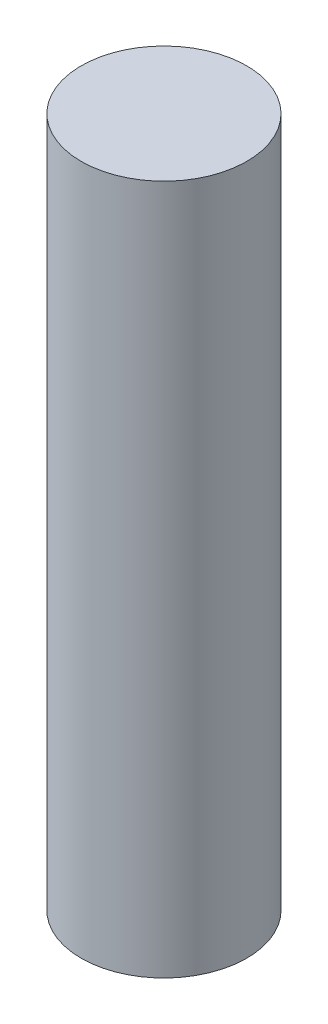
ISO-10303-21;
HEADER;
FILE_DESCRIPTION(('STEP AP214'),'2;1');
FILE_NAME('part.step','',(''),(''),'','','');
FILE_SCHEMA(('AUTOMOTIVE_DESIGN { 1 0 10303 214 1 1 1 1 }'));
ENDSEC;
DATA;
#1=APPLICATION_CONTEXT('core data for automotive mechanical design processes');
#2=APPLICATION_PROTOCOL_DEFINITION('international standard','automotive_design',2000,#1);
#3=PRODUCT_CONTEXT('',#1,'mechanical');
#4=PRODUCT('Part','Part','',(#3));
#5=PRODUCT_RELATED_PRODUCT_CATEGORY('part','',(#4));
#6=PRODUCT_DEFINITION_FORMATION('','',#4);
#7=PRODUCT_DEFINITION_CONTEXT('part definition',#1,'design');
#8=PRODUCT_DEFINITION('design','',#6,#7);
#9=PRODUCT_DEFINITION_SHAPE('','',#8);
#10=(LENGTH_UNIT() NAMED_UNIT(*) SI_UNIT(.MILLI.,.METRE.));
#11=(NAMED_UNIT(*) PLANE_ANGLE_UNIT() SI_UNIT($,.RADIAN.));
#12=(NAMED_UNIT(*) SI_UNIT($,.STERADIAN.) SOLID_ANGLE_UNIT());
#13=UNCERTAINTY_MEASURE_WITH_UNIT(LENGTH_MEASURE(1.E-05),#10,'distance_accuracy_value','');
#14=(GEOMETRIC_REPRESENTATION_CONTEXT(3) GLOBAL_UNCERTAINTY_ASSIGNED_CONTEXT((#13)) GLOBAL_UNIT_ASSIGNED_CONTEXT((#10,
#11,#12)) REPRESENTATION_CONTEXT('',''));
#15=CARTESIAN_POINT('',(0.,0.,0.));
#16=DIRECTION('',(0.,0.,1.));
#17=DIRECTION('',(1.,0.,0.));
#18=AXIS2_PLACEMENT_3D('',#15,#16,#17);
#19=CARTESIAN_POINT('',(0.,250.,0.));
#20=DIRECTION('',(0.,-1.,0.));
#21=DIRECTION('',(0.,0.,-1.));
#22=AXIS2_PLACEMENT_3D('',#19,#20,#21);
#23=CYLINDRICAL_SURFACE('',#22,30.);
#24=CARTESIAN_POINT('',(0.,250.,0.));
#25=DIRECTION('',(0.,1.,0.));
#26=DIRECTION('',(0.,0.,1.));
#27=AXIS2_PLACEMENT_3D('',#24,#25,#26);
#28=CIRCLE('',#27,30.);
#29=CARTESIAN_POINT('',(0.,250.,30.));
#30=VERTEX_POINT('',#29);
#31=EDGE_CURVE('E10',#30,#30,#28,.T.);
#32=ORIENTED_EDGE('',*,*,#31,.F.);
#33=EDGE_LOOP('',(#32));
#34=FACE_BOUND('',#33,.T.);
#35=CARTESIAN_POINT('',(0.,0.,0.));
#36=DIRECTION('',(0.,1.,0.));
#37=DIRECTION('',(0.,0.,1.));
#38=AXIS2_PLACEMENT_3D('',#35,#36,#37);
#39=CIRCLE('',#38,30.);
#40=CARTESIAN_POINT('',(0.,0.,30.));
#41=VERTEX_POINT('',#40);
#42=EDGE_CURVE('E40',#41,#41,#39,.T.);
#43=ORIENTED_EDGE('',*,*,#42,.T.);
#44=EDGE_LOOP('',(#43));
#45=FACE_BOUND('',#44,.T.);
#46=ADVANCED_FACE('F37',(#34,#45),#23,.T.);
#47=CARTESIAN_POINT('',(0.,250.,0.));
#48=DIRECTION('',(0.,1.,0.));
#49=DIRECTION('',(0.,0.,1.));
#50=AXIS2_PLACEMENT_3D('',#47,#48,#49);
#51=PLANE('',#50);
#52=ORIENTED_EDGE('',*,*,#31,.T.);
#53=EDGE_LOOP('',(#52));
#54=FACE_BOUND('',#53,.T.);
#55=ADVANCED_FACE('F54',(#54),#51,.T.);
#56=CARTESIAN_POINT('',(0.,0.,0.));
#57=DIRECTION('',(0.,1.,0.));
#58=DIRECTION('',(0.,0.,1.));
#59=AXIS2_PLACEMENT_3D('',#56,#57,#58);
#60=PLANE('',#59);
#61=ORIENTED_EDGE('',*,*,#42,.F.);
#62=EDGE_LOOP('',(#61));
#63=FACE_BOUND('',#62,.T.);
#64=ADVANCED_FACE('F52',(#63),#60,.F.);
#65=CLOSED_SHELL('',(#46,#55,#64));
#66=MANIFOLD_SOLID_BREP('B2',#65);
#67=ADVANCED_BREP_SHAPE_REPRESENTATION('',(#18,#66),#14);
#68=SHAPE_DEFINITION_REPRESENTATION(#9,#67);
ENDSEC;
END-ISO-10303-21;
